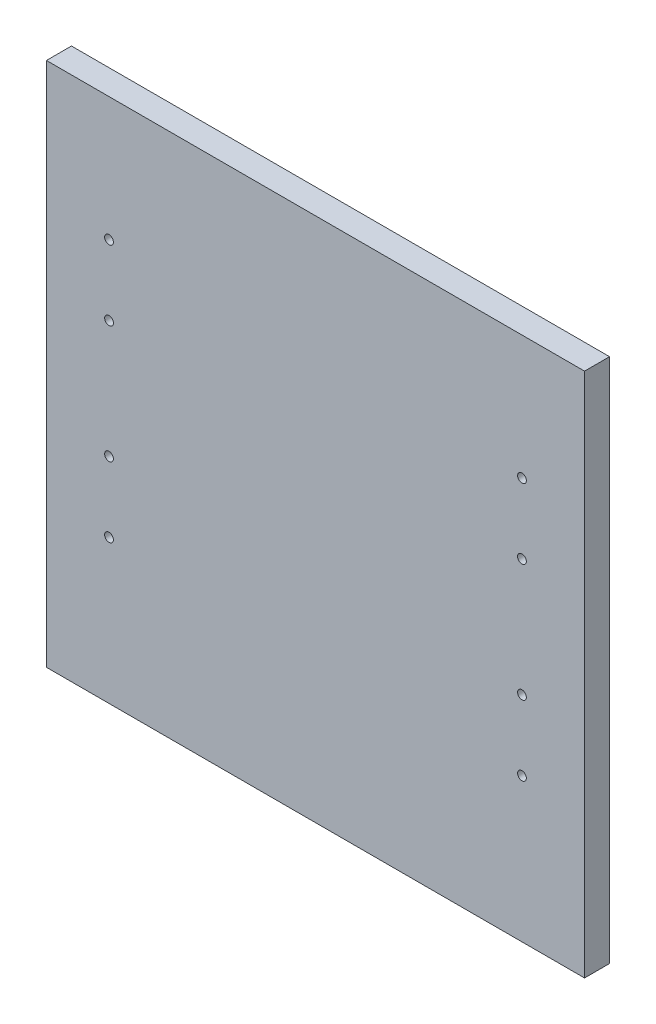
ISO-10303-21;
HEADER;
FILE_DESCRIPTION(('STEP AP214'),'2;1');
FILE_NAME('part.step','',(''),(''),'','','');
FILE_SCHEMA(('AUTOMOTIVE_DESIGN { 1 0 10303 214 1 1 1 1 }'));
ENDSEC;
DATA;
#1=APPLICATION_CONTEXT('core data for automotive mechanical design processes');
#2=APPLICATION_PROTOCOL_DEFINITION('international standard','automotive_design',2000,#1);
#3=PRODUCT_CONTEXT('',#1,'mechanical');
#4=PRODUCT('Part','Part','',(#3));
#5=PRODUCT_RELATED_PRODUCT_CATEGORY('part','',(#4));
#6=PRODUCT_DEFINITION_FORMATION('','',#4);
#7=PRODUCT_DEFINITION_CONTEXT('part definition',#1,'design');
#8=PRODUCT_DEFINITION('design','',#6,#7);
#9=PRODUCT_DEFINITION_SHAPE('','',#8);
#10=(LENGTH_UNIT() NAMED_UNIT(*) SI_UNIT(.MILLI.,.METRE.));
#11=(NAMED_UNIT(*) PLANE_ANGLE_UNIT() SI_UNIT($,.RADIAN.));
#12=(NAMED_UNIT(*) SI_UNIT($,.STERADIAN.) SOLID_ANGLE_UNIT());
#13=UNCERTAINTY_MEASURE_WITH_UNIT(LENGTH_MEASURE(1.E-05),#10,'distance_accuracy_value','');
#14=(GEOMETRIC_REPRESENTATION_CONTEXT(3) GLOBAL_UNCERTAINTY_ASSIGNED_CONTEXT((#13)) GLOBAL_UNIT_ASSIGNED_CONTEXT((#10,
#11,#12)) REPRESENTATION_CONTEXT('',''));
#15=CARTESIAN_POINT('',(0.,0.,0.));
#16=DIRECTION('',(0.,0.,1.));
#17=DIRECTION('',(1.,0.,0.));
#18=AXIS2_PLACEMENT_3D('',#15,#16,#17);
#19=CARTESIAN_POINT('',(215.,0.,20.));
#20=DIRECTION('',(1.,0.,0.));
#21=DIRECTION('',(0.,0.,-1.));
#22=AXIS2_PLACEMENT_3D('',#19,#20,#21);
#23=PLANE('',#22);
#24=DIRECTION('',(0.,-1.,0.));
#25=VECTOR('',#24,1.);
#26=CARTESIAN_POINT('',(215.,0.,0.));
#27=LINE('',#26,#25);
#28=CARTESIAN_POINT('',(215.,210.,0.));
#29=VERTEX_POINT('',#28);
#30=CARTESIAN_POINT('',(215.,-210.,0.));
#31=VERTEX_POINT('',#30);
#32=EDGE_CURVE('E130',#29,#31,#27,.T.);
#33=ORIENTED_EDGE('',*,*,#32,.F.);
#34=DIRECTION('',(0.,0.,-1.));
#35=VECTOR('',#34,1.);
#36=CARTESIAN_POINT('',(215.,210.,20.));
#37=LINE('',#36,#35);
#38=CARTESIAN_POINT('',(215.,210.,20.));
#39=VERTEX_POINT('',#38);
#40=EDGE_CURVE('E11',#39,#29,#37,.T.);
#41=ORIENTED_EDGE('',*,*,#40,.F.);
#42=DIRECTION('',(0.,-1.,0.));
#43=VECTOR('',#42,1.);
#44=CARTESIAN_POINT('',(215.,0.,20.));
#45=LINE('',#44,#43);
#46=CARTESIAN_POINT('',(215.,-210.,20.));
#47=VERTEX_POINT('',#46);
#48=EDGE_CURVE('E99',#39,#47,#45,.T.);
#49=ORIENTED_EDGE('',*,*,#48,.T.);
#50=DIRECTION('',(0.,0.,-1.));
#51=VECTOR('',#50,1.);
#52=CARTESIAN_POINT('',(215.,-210.,20.));
#53=LINE('',#52,#51);
#54=EDGE_CURVE('E77',#47,#31,#53,.T.);
#55=ORIENTED_EDGE('',*,*,#54,.T.);
#56=EDGE_LOOP('',(#33,#41,#49,#55));
#57=FACE_BOUND('',#56,.T.);
#58=ADVANCED_FACE('F37',(#57),#23,.T.);
#59=CARTESIAN_POINT('',(0.,210.,20.));
#60=DIRECTION('',(0.,1.,0.));
#61=DIRECTION('',(-1.,0.,0.));
#62=AXIS2_PLACEMENT_3D('',#59,#60,#61);
#63=PLANE('',#62);
#64=DIRECTION('',(1.,0.,0.));
#65=VECTOR('',#64,1.);
#66=CARTESIAN_POINT('',(0.,210.,0.));
#67=LINE('',#66,#65);
#68=CARTESIAN_POINT('',(-215.,210.,0.));
#69=VERTEX_POINT('',#68);
#70=EDGE_CURVE('E89',#69,#29,#67,.T.);
#71=ORIENTED_EDGE('',*,*,#70,.F.);
#72=DIRECTION('',(0.,0.,-1.));
#73=VECTOR('',#72,1.);
#74=CARTESIAN_POINT('',(-215.,210.,20.));
#75=LINE('',#74,#73);
#76=CARTESIAN_POINT('',(-215.,210.,20.));
#77=VERTEX_POINT('',#76);
#78=EDGE_CURVE('E46',#77,#69,#75,.T.);
#79=ORIENTED_EDGE('',*,*,#78,.F.);
#80=DIRECTION('',(1.,0.,0.));
#81=VECTOR('',#80,1.);
#82=CARTESIAN_POINT('',(0.,210.,20.));
#83=LINE('',#82,#81);
#84=EDGE_CURVE('E87',#77,#39,#83,.T.);
#85=ORIENTED_EDGE('',*,*,#84,.T.);
#86=ORIENTED_EDGE('',*,*,#40,.T.);
#87=EDGE_LOOP('',(#71,#79,#85,#86));
#88=FACE_BOUND('',#87,.T.);
#89=ADVANCED_FACE('F85',(#88),#63,.T.);
#90=CARTESIAN_POINT('',(-215.,0.,20.));
#91=DIRECTION('',(1.,0.,0.));
#92=DIRECTION('',(0.,0.,-1.));
#93=AXIS2_PLACEMENT_3D('',#90,#91,#92);
#94=PLANE('',#93);
#95=DIRECTION('',(0.,-1.,0.));
#96=VECTOR('',#95,1.);
#97=CARTESIAN_POINT('',(-215.,0.,0.));
#98=LINE('',#97,#96);
#99=CARTESIAN_POINT('',(-215.,-210.,0.));
#100=VERTEX_POINT('',#99);
#101=EDGE_CURVE('E133',#69,#100,#98,.T.);
#102=ORIENTED_EDGE('',*,*,#101,.T.);
#103=DIRECTION('',(0.,0.,-1.));
#104=VECTOR('',#103,1.);
#105=CARTESIAN_POINT('',(-215.,-210.,20.));
#106=LINE('',#105,#104);
#107=CARTESIAN_POINT('',(-215.,-210.,20.));
#108=VERTEX_POINT('',#107);
#109=EDGE_CURVE('E92',#108,#100,#106,.T.);
#110=ORIENTED_EDGE('',*,*,#109,.F.);
#111=DIRECTION('',(0.,-1.,0.));
#112=VECTOR('',#111,1.);
#113=CARTESIAN_POINT('',(-215.,0.,20.));
#114=LINE('',#113,#112);
#115=EDGE_CURVE('E94',#77,#108,#114,.T.);
#116=ORIENTED_EDGE('',*,*,#115,.F.);
#117=ORIENTED_EDGE('',*,*,#78,.T.);
#118=EDGE_LOOP('',(#102,#110,#116,#117));
#119=FACE_BOUND('',#118,.T.);
#120=ADVANCED_FACE('F95',(#119),#94,.F.);
#121=CARTESIAN_POINT('',(-165.,-95.,20.));
#122=DIRECTION('',(0.,0.,-1.));
#123=DIRECTION('',(-1.,0.,0.));
#124=AXIS2_PLACEMENT_3D('',#121,#122,#123);
#125=CYLINDRICAL_SURFACE('',#124,3.49999999999999);
#126=CARTESIAN_POINT('',(-165.,-95.,20.));
#127=DIRECTION('',(0.,0.,1.));
#128=DIRECTION('',(1.,0.,0.));
#129=AXIS2_PLACEMENT_3D('',#126,#127,#128);
#130=CIRCLE('',#129,3.49999999999999);
#131=CARTESIAN_POINT('',(-161.5,-95.,20.));
#132=VERTEX_POINT('',#131);
#133=EDGE_CURVE('E106',#132,#132,#130,.F.);
#134=ORIENTED_EDGE('',*,*,#133,.F.);
#135=EDGE_LOOP('',(#134));
#136=FACE_BOUND('',#135,.T.);
#137=CARTESIAN_POINT('',(-165.,-95.,0.));
#138=DIRECTION('',(0.,0.,1.));
#139=DIRECTION('',(1.,0.,0.));
#140=AXIS2_PLACEMENT_3D('',#137,#138,#139);
#141=CIRCLE('',#140,3.49999999999999);
#142=CARTESIAN_POINT('',(-161.5,-95.,0.));
#143=VERTEX_POINT('',#142);
#144=EDGE_CURVE('E136',#143,#143,#141,.F.);
#145=ORIENTED_EDGE('',*,*,#144,.T.);
#146=EDGE_LOOP('',(#145));
#147=FACE_BOUND('',#146,.T.);
#148=ADVANCED_FACE('F210',(#136,#147),#125,.F.);
#149=CARTESIAN_POINT('',(0.,-210.,20.));
#150=DIRECTION('',(0.,1.,0.));
#151=DIRECTION('',(-1.,0.,0.));
#152=AXIS2_PLACEMENT_3D('',#149,#150,#151);
#153=PLANE('',#152);
#154=DIRECTION('',(1.,0.,0.));
#155=VECTOR('',#154,1.);
#156=CARTESIAN_POINT('',(0.,-210.,0.));
#157=LINE('',#156,#155);
#158=EDGE_CURVE('E70',#100,#31,#157,.T.);
#159=ORIENTED_EDGE('',*,*,#158,.T.);
#160=ORIENTED_EDGE('',*,*,#54,.F.);
#161=DIRECTION('',(1.,0.,0.));
#162=VECTOR('',#161,1.);
#163=CARTESIAN_POINT('',(0.,-210.,20.));
#164=LINE('',#163,#162);
#165=EDGE_CURVE('E54',#108,#47,#164,.T.);
#166=ORIENTED_EDGE('',*,*,#165,.F.);
#167=ORIENTED_EDGE('',*,*,#109,.T.);
#168=EDGE_LOOP('',(#159,#160,#166,#167));
#169=FACE_BOUND('',#168,.T.);
#170=ADVANCED_FACE('F145',(#169),#153,.F.);
#171=CARTESIAN_POINT('',(-165.,111.,20.));
#172=DIRECTION('',(0.,0.,-1.));
#173=DIRECTION('',(-1.,0.,0.));
#174=AXIS2_PLACEMENT_3D('',#171,#172,#173);
#175=CYLINDRICAL_SURFACE('',#174,3.49999999999999);
#176=CARTESIAN_POINT('',(-165.,111.,20.));
#177=DIRECTION('',(0.,0.,1.));
#178=DIRECTION('',(1.,0.,0.));
#179=AXIS2_PLACEMENT_3D('',#176,#177,#178);
#180=CIRCLE('',#179,3.49999999999999);
#181=CARTESIAN_POINT('',(-161.5,111.,20.));
#182=VERTEX_POINT('',#181);
#183=EDGE_CURVE('E101',#182,#182,#180,.T.);
#184=ORIENTED_EDGE('',*,*,#183,.T.);
#185=EDGE_LOOP('',(#184));
#186=FACE_BOUND('',#185,.T.);
#187=CARTESIAN_POINT('',(-165.,111.,0.));
#188=DIRECTION('',(0.,0.,1.));
#189=DIRECTION('',(1.,0.,0.));
#190=AXIS2_PLACEMENT_3D('',#187,#188,#189);
#191=CIRCLE('',#190,3.49999999999999);
#192=CARTESIAN_POINT('',(-161.5,111.,0.));
#193=VERTEX_POINT('',#192);
#194=EDGE_CURVE('E127',#193,#193,#191,.T.);
#195=ORIENTED_EDGE('',*,*,#194,.F.);
#196=EDGE_LOOP('',(#195));
#197=FACE_BOUND('',#196,.T.);
#198=ADVANCED_FACE('F156',(#186,#197),#175,.F.);
#199=CARTESIAN_POINT('',(-165.,55.,20.));
#200=DIRECTION('',(0.,0.,-1.));
#201=DIRECTION('',(-1.,0.,0.));
#202=AXIS2_PLACEMENT_3D('',#199,#200,#201);
#203=CYLINDRICAL_SURFACE('',#202,3.49999999999999);
#204=CARTESIAN_POINT('',(-165.,55.,20.));
#205=DIRECTION('',(0.,0.,1.));
#206=DIRECTION('',(1.,0.,0.));
#207=AXIS2_PLACEMENT_3D('',#204,#205,#206);
#208=CIRCLE('',#207,3.49999999999999);
#209=CARTESIAN_POINT('',(-161.5,55.,20.));
#210=VERTEX_POINT('',#209);
#211=EDGE_CURVE('E324',#210,#210,#208,.T.);
#212=ORIENTED_EDGE('',*,*,#211,.T.);
#213=EDGE_LOOP('',(#212));
#214=FACE_BOUND('',#213,.T.);
#215=CARTESIAN_POINT('',(-165.,55.,0.));
#216=DIRECTION('',(0.,0.,1.));
#217=DIRECTION('',(1.,0.,0.));
#218=AXIS2_PLACEMENT_3D('',#215,#216,#217);
#219=CIRCLE('',#218,3.49999999999999);
#220=CARTESIAN_POINT('',(-161.5,55.,0.));
#221=VERTEX_POINT('',#220);
#222=EDGE_CURVE('E124',#221,#221,#219,.T.);
#223=ORIENTED_EDGE('',*,*,#222,.F.);
#224=EDGE_LOOP('',(#223));
#225=FACE_BOUND('',#224,.T.);
#226=ADVANCED_FACE('F159',(#214,#225),#203,.F.);
#227=CARTESIAN_POINT('',(-165.,-39.,20.));
#228=DIRECTION('',(0.,0.,-1.));
#229=DIRECTION('',(-1.,0.,0.));
#230=AXIS2_PLACEMENT_3D('',#227,#228,#229);
#231=CYLINDRICAL_SURFACE('',#230,3.49999999999999);
#232=CARTESIAN_POINT('',(-165.,-39.,20.));
#233=DIRECTION('',(0.,0.,1.));
#234=DIRECTION('',(1.,0.,0.));
#235=AXIS2_PLACEMENT_3D('',#232,#233,#234);
#236=CIRCLE('',#235,3.49999999999999);
#237=CARTESIAN_POINT('',(-161.5,-39.,20.));
#238=VERTEX_POINT('',#237);
#239=EDGE_CURVE('E320',#238,#238,#236,.F.);
#240=ORIENTED_EDGE('',*,*,#239,.F.);
#241=EDGE_LOOP('',(#240));
#242=FACE_BOUND('',#241,.T.);
#243=CARTESIAN_POINT('',(-165.,-39.,0.));
#244=DIRECTION('',(0.,0.,1.));
#245=DIRECTION('',(1.,0.,0.));
#246=AXIS2_PLACEMENT_3D('',#243,#244,#245);
#247=CIRCLE('',#246,3.49999999999999);
#248=CARTESIAN_POINT('',(-161.5,-39.,0.));
#249=VERTEX_POINT('',#248);
#250=EDGE_CURVE('E121',#249,#249,#247,.F.);
#251=ORIENTED_EDGE('',*,*,#250,.T.);
#252=EDGE_LOOP('',(#251));
#253=FACE_BOUND('',#252,.T.);
#254=ADVANCED_FACE('F163',(#242,#253),#231,.F.);
#255=CARTESIAN_POINT('',(165.,-95.,20.));
#256=DIRECTION('',(0.,0.,-1.));
#257=DIRECTION('',(-1.,0.,0.));
#258=AXIS2_PLACEMENT_3D('',#255,#256,#257);
#259=CYLINDRICAL_SURFACE('',#258,3.49999999999999);
#260=CARTESIAN_POINT('',(165.,-95.,20.));
#261=DIRECTION('',(0.,0.,1.));
#262=DIRECTION('',(1.,0.,0.));
#263=AXIS2_PLACEMENT_3D('',#260,#261,#262);
#264=CIRCLE('',#263,3.49999999999999);
#265=CARTESIAN_POINT('',(168.5,-95.,20.));
#266=VERTEX_POINT('',#265);
#267=EDGE_CURVE('E316',#266,#266,#264,.T.);
#268=ORIENTED_EDGE('',*,*,#267,.T.);
#269=EDGE_LOOP('',(#268));
#270=FACE_BOUND('',#269,.T.);
#271=CARTESIAN_POINT('',(165.,-95.,0.));
#272=DIRECTION('',(0.,0.,1.));
#273=DIRECTION('',(1.,0.,0.));
#274=AXIS2_PLACEMENT_3D('',#271,#272,#273);
#275=CIRCLE('',#274,3.49999999999999);
#276=CARTESIAN_POINT('',(168.5,-95.,0.));
#277=VERTEX_POINT('',#276);
#278=EDGE_CURVE('E118',#277,#277,#275,.T.);
#279=ORIENTED_EDGE('',*,*,#278,.F.);
#280=EDGE_LOOP('',(#279));
#281=FACE_BOUND('',#280,.T.);
#282=ADVANCED_FACE('F167',(#270,#281),#259,.F.);
#283=CARTESIAN_POINT('',(165.,-39.,20.));
#284=DIRECTION('',(0.,0.,-1.));
#285=DIRECTION('',(-1.,0.,0.));
#286=AXIS2_PLACEMENT_3D('',#283,#284,#285);
#287=CYLINDRICAL_SURFACE('',#286,3.49999999999999);
#288=CARTESIAN_POINT('',(165.,-39.,20.));
#289=DIRECTION('',(0.,0.,1.));
#290=DIRECTION('',(1.,0.,0.));
#291=AXIS2_PLACEMENT_3D('',#288,#289,#290);
#292=CIRCLE('',#291,3.49999999999999);
#293=CARTESIAN_POINT('',(168.5,-39.,20.));
#294=VERTEX_POINT('',#293);
#295=EDGE_CURVE('E182',#294,#294,#292,.T.);
#296=ORIENTED_EDGE('',*,*,#295,.T.);
#297=EDGE_LOOP('',(#296));
#298=FACE_BOUND('',#297,.T.);
#299=CARTESIAN_POINT('',(165.,-39.,0.));
#300=DIRECTION('',(0.,0.,1.));
#301=DIRECTION('',(1.,0.,0.));
#302=AXIS2_PLACEMENT_3D('',#299,#300,#301);
#303=CIRCLE('',#302,3.49999999999999);
#304=CARTESIAN_POINT('',(168.5,-39.,0.));
#305=VERTEX_POINT('',#304);
#306=EDGE_CURVE('E115',#305,#305,#303,.T.);
#307=ORIENTED_EDGE('',*,*,#306,.F.);
#308=EDGE_LOOP('',(#307));
#309=FACE_BOUND('',#308,.T.);
#310=ADVANCED_FACE('F170',(#298,#309),#287,.F.);
#311=CARTESIAN_POINT('',(165.,55.,20.));
#312=DIRECTION('',(0.,0.,-1.));
#313=DIRECTION('',(-1.,0.,0.));
#314=AXIS2_PLACEMENT_3D('',#311,#312,#313);
#315=CYLINDRICAL_SURFACE('',#314,3.49999999999999);
#316=CARTESIAN_POINT('',(165.,55.,20.));
#317=DIRECTION('',(0.,0.,1.));
#318=DIRECTION('',(1.,0.,0.));
#319=AXIS2_PLACEMENT_3D('',#316,#317,#318);
#320=CIRCLE('',#319,3.49999999999999);
#321=CARTESIAN_POINT('',(168.5,55.,20.));
#322=VERTEX_POINT('',#321);
#323=EDGE_CURVE('E142',#322,#322,#320,.F.);
#324=ORIENTED_EDGE('',*,*,#323,.F.);
#325=EDGE_LOOP('',(#324));
#326=FACE_BOUND('',#325,.T.);
#327=CARTESIAN_POINT('',(165.,55.,0.));
#328=DIRECTION('',(0.,0.,1.));
#329=DIRECTION('',(1.,0.,0.));
#330=AXIS2_PLACEMENT_3D('',#327,#328,#329);
#331=CIRCLE('',#330,3.49999999999999);
#332=CARTESIAN_POINT('',(168.5,55.,0.));
#333=VERTEX_POINT('',#332);
#334=EDGE_CURVE('E112',#333,#333,#331,.F.);
#335=ORIENTED_EDGE('',*,*,#334,.T.);
#336=EDGE_LOOP('',(#335));
#337=FACE_BOUND('',#336,.T.);
#338=ADVANCED_FACE('F39',(#326,#337),#315,.F.);
#339=CARTESIAN_POINT('',(165.,111.,20.));
#340=DIRECTION('',(0.,0.,-1.));
#341=DIRECTION('',(-1.,0.,0.));
#342=AXIS2_PLACEMENT_3D('',#339,#340,#341);
#343=CYLINDRICAL_SURFACE('',#342,3.49999999999999);
#344=CARTESIAN_POINT('',(165.,111.,20.));
#345=DIRECTION('',(0.,0.,1.));
#346=DIRECTION('',(1.,0.,0.));
#347=AXIS2_PLACEMENT_3D('',#344,#345,#346);
#348=CIRCLE('',#347,3.49999999999999);
#349=CARTESIAN_POINT('',(168.5,111.,20.));
#350=VERTEX_POINT('',#349);
#351=EDGE_CURVE('E109',#350,#350,#348,.F.);
#352=ORIENTED_EDGE('',*,*,#351,.F.);
#353=EDGE_LOOP('',(#352));
#354=FACE_BOUND('',#353,.T.);
#355=CARTESIAN_POINT('',(165.,111.,0.));
#356=DIRECTION('',(0.,0.,1.));
#357=DIRECTION('',(1.,0.,0.));
#358=AXIS2_PLACEMENT_3D('',#355,#356,#357);
#359=CIRCLE('',#358,3.49999999999999);
#360=CARTESIAN_POINT('',(168.5,111.,0.));
#361=VERTEX_POINT('',#360);
#362=EDGE_CURVE('E139',#361,#361,#359,.F.);
#363=ORIENTED_EDGE('',*,*,#362,.T.);
#364=EDGE_LOOP('',(#363));
#365=FACE_BOUND('',#364,.T.);
#366=ADVANCED_FACE('F177',(#354,#365),#343,.F.);
#367=CARTESIAN_POINT('',(0.,0.,20.));
#368=DIRECTION('',(0.,0.,1.));
#369=DIRECTION('',(1.,0.,0.));
#370=AXIS2_PLACEMENT_3D('',#367,#368,#369);
#371=PLANE('',#370);
#372=ORIENTED_EDGE('',*,*,#323,.T.);
#373=EDGE_LOOP('',(#372));
#374=FACE_BOUND('',#373,.T.);
#375=ORIENTED_EDGE('',*,*,#295,.F.);
#376=EDGE_LOOP('',(#375));
#377=FACE_BOUND('',#376,.T.);
#378=ORIENTED_EDGE('',*,*,#267,.F.);
#379=EDGE_LOOP('',(#378));
#380=FACE_BOUND('',#379,.T.);
#381=ORIENTED_EDGE('',*,*,#239,.T.);
#382=EDGE_LOOP('',(#381));
#383=FACE_BOUND('',#382,.T.);
#384=ORIENTED_EDGE('',*,*,#211,.F.);
#385=EDGE_LOOP('',(#384));
#386=FACE_BOUND('',#385,.T.);
#387=ORIENTED_EDGE('',*,*,#183,.F.);
#388=EDGE_LOOP('',(#387));
#389=FACE_BOUND('',#388,.T.);
#390=ORIENTED_EDGE('',*,*,#48,.F.);
#391=ORIENTED_EDGE('',*,*,#84,.F.);
#392=ORIENTED_EDGE('',*,*,#115,.T.);
#393=ORIENTED_EDGE('',*,*,#165,.T.);
#394=EDGE_LOOP('',(#390,#391,#392,#393));
#395=FACE_BOUND('',#394,.T.);
#396=ORIENTED_EDGE('',*,*,#133,.T.);
#397=EDGE_LOOP('',(#396));
#398=FACE_BOUND('',#397,.T.);
#399=ORIENTED_EDGE('',*,*,#351,.T.);
#400=EDGE_LOOP('',(#399));
#401=FACE_BOUND('',#400,.T.);
#402=ADVANCED_FACE('F97',(#374,#377,#380,#383,#386,#389,#395,#398,#401),#371,.T.);
#403=CARTESIAN_POINT('',(0.,0.,0.));
#404=DIRECTION('',(0.,0.,1.));
#405=DIRECTION('',(1.,0.,0.));
#406=AXIS2_PLACEMENT_3D('',#403,#404,#405);
#407=PLANE('',#406);
#408=ORIENTED_EDGE('',*,*,#334,.F.);
#409=EDGE_LOOP('',(#408));
#410=FACE_BOUND('',#409,.T.);
#411=ORIENTED_EDGE('',*,*,#306,.T.);
#412=EDGE_LOOP('',(#411));
#413=FACE_BOUND('',#412,.T.);
#414=ORIENTED_EDGE('',*,*,#278,.T.);
#415=EDGE_LOOP('',(#414));
#416=FACE_BOUND('',#415,.T.);
#417=ORIENTED_EDGE('',*,*,#250,.F.);
#418=EDGE_LOOP('',(#417));
#419=FACE_BOUND('',#418,.T.);
#420=ORIENTED_EDGE('',*,*,#222,.T.);
#421=EDGE_LOOP('',(#420));
#422=FACE_BOUND('',#421,.T.);
#423=ORIENTED_EDGE('',*,*,#194,.T.);
#424=EDGE_LOOP('',(#423));
#425=FACE_BOUND('',#424,.T.);
#426=ORIENTED_EDGE('',*,*,#32,.T.);
#427=ORIENTED_EDGE('',*,*,#158,.F.);
#428=ORIENTED_EDGE('',*,*,#101,.F.);
#429=ORIENTED_EDGE('',*,*,#70,.T.);
#430=EDGE_LOOP('',(#426,#427,#428,#429));
#431=FACE_BOUND('',#430,.T.);
#432=ORIENTED_EDGE('',*,*,#144,.F.);
#433=EDGE_LOOP('',(#432));
#434=FACE_BOUND('',#433,.T.);
#435=ORIENTED_EDGE('',*,*,#362,.F.);
#436=EDGE_LOOP('',(#435));
#437=FACE_BOUND('',#436,.T.);
#438=ADVANCED_FACE('F146',(#410,#413,#416,#419,#422,#425,#431,#434,#437),#407,.F.);
#439=CLOSED_SHELL('',(#58,#89,#120,#148,#170,#198,#226,#254,#282,#310,#338,#366,#402,#438));
#440=MANIFOLD_SOLID_BREP('B2',#439);
#441=ADVANCED_BREP_SHAPE_REPRESENTATION('',(#18,#440),#14);
#442=SHAPE_DEFINITION_REPRESENTATION(#9,#441);
ENDSEC;
END-ISO-10303-21;
